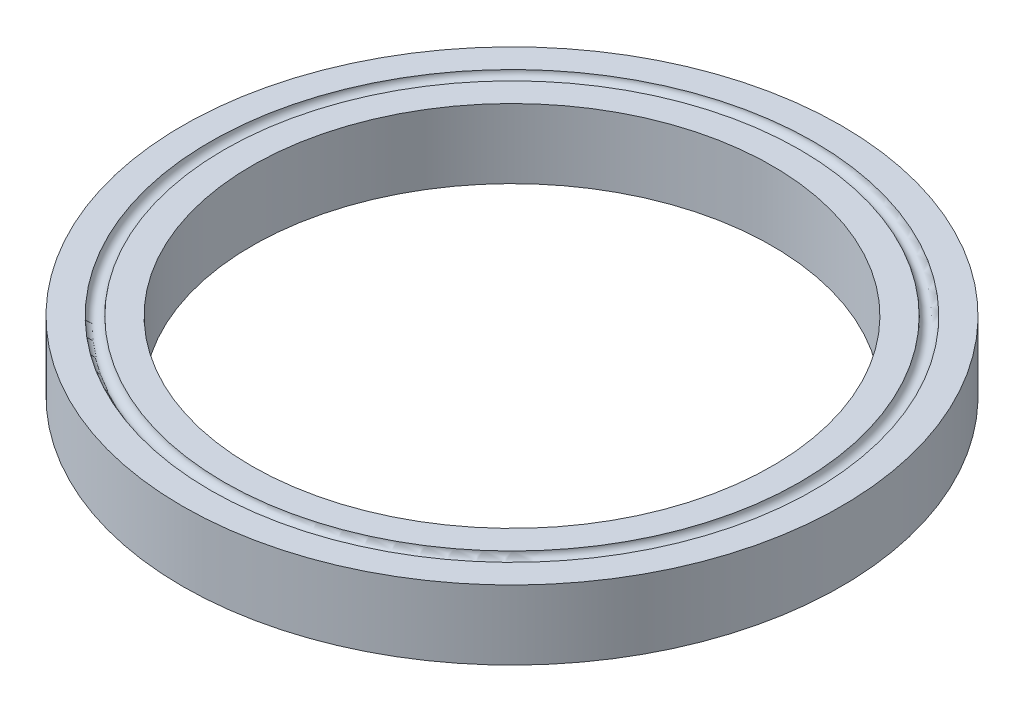
ISO-10303-21;
HEADER;
FILE_DESCRIPTION(('STEP AP214'),'2;1');
FILE_NAME('part.step','',(''),(''),'','','');
FILE_SCHEMA(('AUTOMOTIVE_DESIGN { 1 0 10303 214 1 1 1 1 }'));
ENDSEC;
DATA;
#1=APPLICATION_CONTEXT('core data for automotive mechanical design processes');
#2=APPLICATION_PROTOCOL_DEFINITION('international standard','automotive_design',2000,#1);
#3=PRODUCT_CONTEXT('',#1,'mechanical');
#4=PRODUCT('Part','Part','',(#3));
#5=PRODUCT_RELATED_PRODUCT_CATEGORY('part','',(#4));
#6=PRODUCT_DEFINITION_FORMATION('','',#4);
#7=PRODUCT_DEFINITION_CONTEXT('part definition',#1,'design');
#8=PRODUCT_DEFINITION('design','',#6,#7);
#9=PRODUCT_DEFINITION_SHAPE('','',#8);
#10=(LENGTH_UNIT() NAMED_UNIT(*) SI_UNIT(.MILLI.,.METRE.));
#11=(NAMED_UNIT(*) PLANE_ANGLE_UNIT() SI_UNIT($,.RADIAN.));
#12=(NAMED_UNIT(*) SI_UNIT($,.STERADIAN.) SOLID_ANGLE_UNIT());
#13=UNCERTAINTY_MEASURE_WITH_UNIT(LENGTH_MEASURE(1.E-05),#10,'distance_accuracy_value','');
#14=(GEOMETRIC_REPRESENTATION_CONTEXT(3) GLOBAL_UNCERTAINTY_ASSIGNED_CONTEXT((#13)) GLOBAL_UNIT_ASSIGNED_CONTEXT((#10,
#11,#12)) REPRESENTATION_CONTEXT('',''));
#15=CARTESIAN_POINT('',(0.,0.,0.));
#16=DIRECTION('',(0.,0.,1.));
#17=DIRECTION('',(1.,0.,0.));
#18=AXIS2_PLACEMENT_3D('',#15,#16,#17);
#19=CARTESIAN_POINT('',(0.,0.,0.));
#20=DIRECTION('',(0.,1.,0.));
#21=DIRECTION('',(0.,0.,1.));
#22=AXIS2_PLACEMENT_3D('',#19,#20,#21);
#23=CYLINDRICAL_SURFACE('',#22,37.5);
#24=CARTESIAN_POINT('',(0.,-10.,0.));
#25=DIRECTION('',(0.,1.,0.));
#26=DIRECTION('',(0.,0.,1.));
#27=AXIS2_PLACEMENT_3D('',#24,#25,#26);
#28=CIRCLE('',#27,37.5);
#29=CARTESIAN_POINT('',(0.,-10.,37.5));
#30=VERTEX_POINT('',#29);
#31=EDGE_CURVE('E10',#30,#30,#28,.T.);
#32=ORIENTED_EDGE('',*,*,#31,.F.);
#33=EDGE_LOOP('',(#32));
#34=FACE_BOUND('',#33,.T.);
#35=CARTESIAN_POINT('',(0.,0.,0.));
#36=DIRECTION('',(0.,1.,0.));
#37=DIRECTION('',(0.,0.,1.));
#38=AXIS2_PLACEMENT_3D('',#35,#36,#37);
#39=CIRCLE('',#38,37.5);
#40=CARTESIAN_POINT('',(0.,0.,37.5));
#41=VERTEX_POINT('',#40);
#42=EDGE_CURVE('E60',#41,#41,#39,.T.);
#43=ORIENTED_EDGE('',*,*,#42,.T.);
#44=EDGE_LOOP('',(#43));
#45=FACE_BOUND('',#44,.T.);
#46=ADVANCED_FACE('F32',(#34,#45),#23,.F.);
#47=CARTESIAN_POINT('',(41.5,-10.,0.));
#48=DIRECTION('',(0.,1.,0.));
#49=DIRECTION('',(0.,0.,1.));
#50=AXIS2_PLACEMENT_3D('',#47,#48,#49);
#51=PLANE('',#50);
#52=CARTESIAN_POINT('',(0.,-10.,0.));
#53=DIRECTION('',(0.,1.,0.));
#54=DIRECTION('',(0.,0.,1.));
#55=AXIS2_PLACEMENT_3D('',#52,#53,#54);
#56=CIRCLE('',#55,41.5);
#57=CARTESIAN_POINT('',(0.,-10.,41.5));
#58=VERTEX_POINT('',#57);
#59=EDGE_CURVE('E38',#58,#58,#56,.T.);
#60=ORIENTED_EDGE('',*,*,#59,.F.);
#61=EDGE_LOOP('',(#60));
#62=FACE_BOUND('',#61,.T.);
#63=ORIENTED_EDGE('',*,*,#31,.T.);
#64=EDGE_LOOP('',(#63));
#65=FACE_BOUND('',#64,.T.);
#66=ADVANCED_FACE('F97',(#62,#65),#51,.F.);
#67=CARTESIAN_POINT('',(0.,-10.,0.));
#68=DIRECTION('',(0.,1.,0.));
#69=DIRECTION('',(0.,0.,1.));
#70=AXIS2_PLACEMENT_3D('',#67,#68,#69);
#71=TOROIDAL_SURFACE('',#70,42.5,1.);
#72=CARTESIAN_POINT('',(0.,-10.,0.));
#73=DIRECTION('',(0.,1.,0.));
#74=DIRECTION('',(0.,0.,1.));
#75=AXIS2_PLACEMENT_3D('',#72,#73,#74);
#76=CIRCLE('',#75,43.5);
#77=CARTESIAN_POINT('',(0.,-10.,43.5));
#78=VERTEX_POINT('',#77);
#79=EDGE_CURVE('E42',#78,#78,#76,.T.);
#80=ORIENTED_EDGE('',*,*,#79,.F.);
#81=EDGE_LOOP('',(#80));
#82=FACE_BOUND('',#81,.T.);
#83=ORIENTED_EDGE('',*,*,#59,.T.);
#84=EDGE_LOOP('',(#83));
#85=FACE_BOUND('',#84,.T.);
#86=ADVANCED_FACE('F92',(#82,#85),#71,.F.);
#87=CARTESIAN_POINT('',(47.5,-10.,0.));
#88=DIRECTION('',(0.,1.,0.));
#89=DIRECTION('',(0.,0.,1.));
#90=AXIS2_PLACEMENT_3D('',#87,#88,#89);
#91=PLANE('',#90);
#92=CARTESIAN_POINT('',(0.,-10.,0.));
#93=DIRECTION('',(0.,1.,0.));
#94=DIRECTION('',(0.,0.,1.));
#95=AXIS2_PLACEMENT_3D('',#92,#93,#94);
#96=CIRCLE('',#95,47.5);
#97=CARTESIAN_POINT('',(0.,-10.,47.5));
#98=VERTEX_POINT('',#97);
#99=EDGE_CURVE('E46',#98,#98,#96,.T.);
#100=ORIENTED_EDGE('',*,*,#99,.F.);
#101=EDGE_LOOP('',(#100));
#102=FACE_BOUND('',#101,.T.);
#103=ORIENTED_EDGE('',*,*,#79,.T.);
#104=EDGE_LOOP('',(#103));
#105=FACE_BOUND('',#104,.T.);
#106=ADVANCED_FACE('F86',(#102,#105),#91,.F.);
#107=CARTESIAN_POINT('',(0.,0.,0.));
#108=DIRECTION('',(0.,1.,0.));
#109=DIRECTION('',(0.,0.,1.));
#110=AXIS2_PLACEMENT_3D('',#107,#108,#109);
#111=CYLINDRICAL_SURFACE('',#110,47.5);
#112=CARTESIAN_POINT('',(0.,0.,0.));
#113=DIRECTION('',(0.,1.,0.));
#114=DIRECTION('',(0.,0.,1.));
#115=AXIS2_PLACEMENT_3D('',#112,#113,#114);
#116=CIRCLE('',#115,47.5);
#117=CARTESIAN_POINT('',(0.,0.,47.5));
#118=VERTEX_POINT('',#117);
#119=EDGE_CURVE('E51',#118,#118,#116,.T.);
#120=ORIENTED_EDGE('',*,*,#119,.F.);
#121=EDGE_LOOP('',(#120));
#122=FACE_BOUND('',#121,.T.);
#123=ORIENTED_EDGE('',*,*,#99,.T.);
#124=EDGE_LOOP('',(#123));
#125=FACE_BOUND('',#124,.T.);
#126=ADVANCED_FACE('F80',(#122,#125),#111,.T.);
#127=CARTESIAN_POINT('',(43.5,0.,0.));
#128=DIRECTION('',(0.,-1.,0.));
#129=DIRECTION('',(0.,0.,-1.));
#130=AXIS2_PLACEMENT_3D('',#127,#128,#129);
#131=PLANE('',#130);
#132=CARTESIAN_POINT('',(0.,0.,0.));
#133=DIRECTION('',(0.,1.,0.));
#134=DIRECTION('',(0.,0.,1.));
#135=AXIS2_PLACEMENT_3D('',#132,#133,#134);
#136=CIRCLE('',#135,43.5);
#137=CARTESIAN_POINT('',(0.,0.,43.5));
#138=VERTEX_POINT('',#137);
#139=EDGE_CURVE('E54',#138,#138,#136,.T.);
#140=ORIENTED_EDGE('',*,*,#139,.F.);
#141=EDGE_LOOP('',(#140));
#142=FACE_BOUND('',#141,.T.);
#143=ORIENTED_EDGE('',*,*,#119,.T.);
#144=EDGE_LOOP('',(#143));
#145=FACE_BOUND('',#144,.T.);
#146=ADVANCED_FACE('F74',(#142,#145),#131,.F.);
#147=CARTESIAN_POINT('',(0.,0.,0.));
#148=DIRECTION('',(0.,1.,0.));
#149=DIRECTION('',(0.,0.,1.));
#150=AXIS2_PLACEMENT_3D('',#147,#148,#149);
#151=TOROIDAL_SURFACE('',#150,42.5,1.);
#152=CARTESIAN_POINT('',(0.,0.,0.));
#153=DIRECTION('',(0.,1.,0.));
#154=DIRECTION('',(0.,0.,1.));
#155=AXIS2_PLACEMENT_3D('',#152,#153,#154);
#156=CIRCLE('',#155,41.5);
#157=CARTESIAN_POINT('',(0.,0.,41.5));
#158=VERTEX_POINT('',#157);
#159=EDGE_CURVE('E57',#158,#158,#156,.T.);
#160=ORIENTED_EDGE('',*,*,#159,.F.);
#161=EDGE_LOOP('',(#160));
#162=FACE_BOUND('',#161,.T.);
#163=ORIENTED_EDGE('',*,*,#139,.T.);
#164=EDGE_LOOP('',(#163));
#165=FACE_BOUND('',#164,.T.);
#166=ADVANCED_FACE('F68',(#162,#165),#151,.F.);
#167=CARTESIAN_POINT('',(37.5,0.,0.));
#168=DIRECTION('',(0.,-1.,0.));
#169=DIRECTION('',(0.,0.,-1.));
#170=AXIS2_PLACEMENT_3D('',#167,#168,#169);
#171=PLANE('',#170);
#172=ORIENTED_EDGE('',*,*,#42,.F.);
#173=EDGE_LOOP('',(#172));
#174=FACE_BOUND('',#173,.T.);
#175=ORIENTED_EDGE('',*,*,#159,.T.);
#176=EDGE_LOOP('',(#175));
#177=FACE_BOUND('',#176,.T.);
#178=ADVANCED_FACE('F65',(#174,#177),#171,.F.);
#179=CLOSED_SHELL('',(#46,#66,#86,#106,#126,#146,#166,#178));
#180=MANIFOLD_SOLID_BREP('B2',#179);
#181=ADVANCED_BREP_SHAPE_REPRESENTATION('',(#18,#180),#14);
#182=SHAPE_DEFINITION_REPRESENTATION(#9,#181);
ENDSEC;
END-ISO-10303-21;
